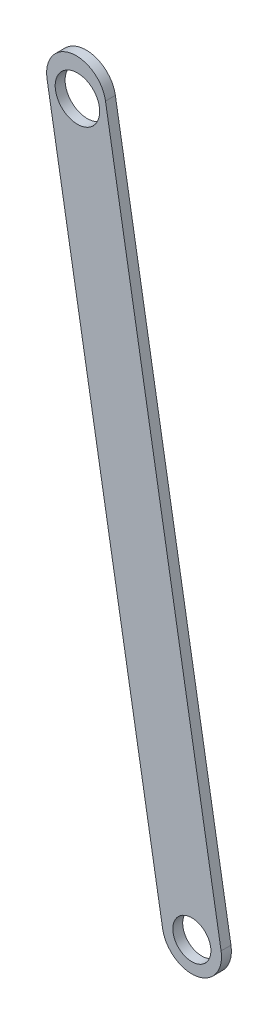
ISO-10303-21;
HEADER;
FILE_DESCRIPTION(('STEP AP214'),'2;1');
FILE_NAME('part.step','',(''),(''),'','','');
FILE_SCHEMA(('AUTOMOTIVE_DESIGN { 1 0 10303 214 1 1 1 1 }'));
ENDSEC;
DATA;
#1=APPLICATION_CONTEXT('core data for automotive mechanical design processes');
#2=APPLICATION_PROTOCOL_DEFINITION('international standard','automotive_design',2000,#1);
#3=PRODUCT_CONTEXT('',#1,'mechanical');
#4=PRODUCT('Part','Part','',(#3));
#5=PRODUCT_RELATED_PRODUCT_CATEGORY('part','',(#4));
#6=PRODUCT_DEFINITION_FORMATION('','',#4);
#7=PRODUCT_DEFINITION_CONTEXT('part definition',#1,'design');
#8=PRODUCT_DEFINITION('design','',#6,#7);
#9=PRODUCT_DEFINITION_SHAPE('','',#8);
#10=(LENGTH_UNIT() NAMED_UNIT(*) SI_UNIT(.MILLI.,.METRE.));
#11=(NAMED_UNIT(*) PLANE_ANGLE_UNIT() SI_UNIT($,.RADIAN.));
#12=(NAMED_UNIT(*) SI_UNIT($,.STERADIAN.) SOLID_ANGLE_UNIT());
#13=UNCERTAINTY_MEASURE_WITH_UNIT(LENGTH_MEASURE(1.E-05),#10,'distance_accuracy_value','');
#14=(GEOMETRIC_REPRESENTATION_CONTEXT(3) GLOBAL_UNCERTAINTY_ASSIGNED_CONTEXT((#13)) GLOBAL_UNIT_ASSIGNED_CONTEXT((#10,
#11,#12)) REPRESENTATION_CONTEXT('',''));
#15=CARTESIAN_POINT('',(0.,0.,0.));
#16=DIRECTION('',(0.,0.,1.));
#17=DIRECTION('',(1.,0.,0.));
#18=AXIS2_PLACEMENT_3D('',#15,#16,#17);
#19=CARTESIAN_POINT('',(-64.4585478566793,-10.9864582362244,6.35));
#20=DIRECTION('',(-0.985783727938957,-0.168019170723975,0.));
#21=DIRECTION('',(0.168019170723975,-0.985783727938957,0.));
#22=AXIS2_PLACEMENT_3D('',#19,#20,#21);
#23=PLANE('',#22);
#24=DIRECTION('',(-0.168019170723975,0.985783727938957,0.));
#25=VECTOR('',#24,1.);
#26=CARTESIAN_POINT('',(-64.4585478566793,-10.9864582362244,0.));
#27=LINE('',#26,#25);
#28=CARTESIAN_POINT('',(-108.220819982763,245.770765202292,0.));
#29=VERTEX_POINT('',#28);
#30=CARTESIAN_POINT('',(-182.478572675931,681.447741602193,0.));
#31=VERTEX_POINT('',#30);
#32=EDGE_CURVE('E119',#29,#31,#27,.T.);
#33=ORIENTED_EDGE('',*,*,#32,.T.);
#34=DIRECTION('',(0.,0.,-1.));
#35=VECTOR('',#34,1.);
#36=CARTESIAN_POINT('',(-182.478572675931,681.447741602193,6.35));
#37=LINE('',#36,#35);
#38=CARTESIAN_POINT('',(-182.478572675931,681.447741602193,6.35));
#39=VERTEX_POINT('',#38);
#40=EDGE_CURVE('E11',#39,#31,#37,.T.);
#41=ORIENTED_EDGE('',*,*,#40,.F.);
#42=DIRECTION('',(-0.168019170723975,0.985783727938957,0.));
#43=VECTOR('',#42,1.);
#44=CARTESIAN_POINT('',(-64.4585478566793,-10.9864582362244,6.35));
#45=LINE('',#44,#43);
#46=CARTESIAN_POINT('',(-108.220819982763,245.770765202292,6.35));
#47=VERTEX_POINT('',#46);
#48=EDGE_CURVE('E96',#47,#39,#45,.T.);
#49=ORIENTED_EDGE('',*,*,#48,.F.);
#50=DIRECTION('',(0.,0.,-1.));
#51=VECTOR('',#50,1.);
#52=CARTESIAN_POINT('',(-108.220819982763,245.770765202292,6.35));
#53=LINE('',#52,#51);
#54=EDGE_CURVE('E118',#47,#29,#53,.T.);
#55=ORIENTED_EDGE('',*,*,#54,.T.);
#56=EDGE_LOOP('',(#33,#41,#49,#55));
#57=FACE_BOUND('',#56,.T.);
#58=ADVANCED_FACE('F47',(#57),#23,.F.);
#59=CARTESIAN_POINT('',(-201.257752693168,678.246976399902,6.35));
#60=DIRECTION('',(0.,0.,-1.));
#61=DIRECTION('',(-1.,0.,0.));
#62=AXIS2_PLACEMENT_3D('',#59,#60,#61);
#63=CYLINDRICAL_SURFACE('',#62,19.0499999999999);
#64=CARTESIAN_POINT('',(-201.257752693168,678.246976399902,0.));
#65=DIRECTION('',(0.,0.,1.));
#66=DIRECTION('',(1.,0.,0.));
#67=AXIS2_PLACEMENT_3D('',#64,#65,#66);
#68=CIRCLE('',#67,19.0499999999999);
#69=CARTESIAN_POINT('',(-220.036932710405,675.04621119761,0.));
#70=VERTEX_POINT('',#69);
#71=EDGE_CURVE('E102',#31,#70,#68,.T.);
#72=ORIENTED_EDGE('',*,*,#71,.T.);
#73=DIRECTION('',(0.,0.,-1.));
#74=VECTOR('',#73,1.);
#75=CARTESIAN_POINT('',(-220.036932710405,675.04621119761,6.35));
#76=LINE('',#75,#74);
#77=CARTESIAN_POINT('',(-220.036932710405,675.04621119761,6.35));
#78=VERTEX_POINT('',#77);
#79=EDGE_CURVE('E56',#78,#70,#76,.T.);
#80=ORIENTED_EDGE('',*,*,#79,.F.);
#81=CARTESIAN_POINT('',(-201.257752693168,678.246976399902,6.35));
#82=DIRECTION('',(0.,0.,1.));
#83=DIRECTION('',(1.,0.,0.));
#84=AXIS2_PLACEMENT_3D('',#81,#82,#83);
#85=CIRCLE('',#84,19.0499999999999);
#86=EDGE_CURVE('E90',#39,#78,#85,.T.);
#87=ORIENTED_EDGE('',*,*,#86,.F.);
#88=ORIENTED_EDGE('',*,*,#40,.T.);
#89=EDGE_LOOP('',(#72,#80,#87,#88));
#90=FACE_BOUND('',#89,.T.);
#91=ADVANCED_FACE('F101',(#90),#63,.T.);
#92=CARTESIAN_POINT('',(-102.016907891154,-17.3879886408078,6.35));
#93=DIRECTION('',(-0.985783727938957,-0.168019170723974,0.));
#94=DIRECTION('',(0.168019170723974,-0.985783727938957,0.));
#95=AXIS2_PLACEMENT_3D('',#92,#93,#94);
#96=PLANE('',#95);
#97=DIRECTION('',(-0.168019170723974,0.985783727938957,0.));
#98=VECTOR('',#97,1.);
#99=CARTESIAN_POINT('',(-102.016907891154,-17.3879886408078,0.));
#100=LINE('',#99,#98);
#101=CARTESIAN_POINT('',(-145.779180017237,239.369234797708,0.));
#102=VERTEX_POINT('',#101);
#103=EDGE_CURVE('E126',#102,#70,#100,.T.);
#104=ORIENTED_EDGE('',*,*,#103,.F.);
#105=DIRECTION('',(0.,0.,-1.));
#106=VECTOR('',#105,1.);
#107=CARTESIAN_POINT('',(-145.779180017237,239.369234797708,6.35));
#108=LINE('',#107,#106);
#109=CARTESIAN_POINT('',(-145.779180017237,239.369234797708,6.35));
#110=VERTEX_POINT('',#109);
#111=EDGE_CURVE('E80',#110,#102,#108,.T.);
#112=ORIENTED_EDGE('',*,*,#111,.F.);
#113=DIRECTION('',(-0.168019170723974,0.985783727938957,0.));
#114=VECTOR('',#113,1.);
#115=CARTESIAN_POINT('',(-102.016907891154,-17.3879886408078,6.35));
#116=LINE('',#115,#114);
#117=EDGE_CURVE('E94',#110,#78,#116,.T.);
#118=ORIENTED_EDGE('',*,*,#117,.T.);
#119=ORIENTED_EDGE('',*,*,#79,.T.);
#120=EDGE_LOOP('',(#104,#112,#118,#119));
#121=FACE_BOUND('',#120,.T.);
#122=ADVANCED_FACE('F107',(#121),#96,.T.);
#123=CARTESIAN_POINT('',(-127.,242.57,6.35));
#124=DIRECTION('',(0.,0.,-1.));
#125=DIRECTION('',(-1.,0.,0.));
#126=AXIS2_PLACEMENT_3D('',#123,#124,#125);
#127=CYLINDRICAL_SURFACE('',#126,19.05);
#128=CARTESIAN_POINT('',(-127.,242.57,0.));
#129=DIRECTION('',(0.,0.,1.));
#130=DIRECTION('',(1.,0.,0.));
#131=AXIS2_PLACEMENT_3D('',#128,#129,#130);
#132=CIRCLE('',#131,19.05);
#133=EDGE_CURVE('E83',#102,#29,#132,.T.);
#134=ORIENTED_EDGE('',*,*,#133,.T.);
#135=ORIENTED_EDGE('',*,*,#54,.F.);
#136=CARTESIAN_POINT('',(-127.,242.57,6.35));
#137=DIRECTION('',(0.,0.,1.));
#138=DIRECTION('',(1.,0.,0.));
#139=AXIS2_PLACEMENT_3D('',#136,#137,#138);
#140=CIRCLE('',#139,19.05);
#141=EDGE_CURVE('E64',#110,#47,#140,.T.);
#142=ORIENTED_EDGE('',*,*,#141,.F.);
#143=ORIENTED_EDGE('',*,*,#111,.T.);
#144=EDGE_LOOP('',(#134,#135,#142,#143));
#145=FACE_BOUND('',#144,.T.);
#146=ADVANCED_FACE('F151',(#145),#127,.T.);
#147=CARTESIAN_POINT('',(-127.,242.57,6.35));
#148=DIRECTION('',(0.,0.,-1.));
#149=DIRECTION('',(-1.,0.,0.));
#150=AXIS2_PLACEMENT_3D('',#147,#148,#149);
#151=CYLINDRICAL_SURFACE('',#150,12.2250669185564);
#152=CARTESIAN_POINT('',(-127.,242.57,6.35));
#153=DIRECTION('',(0.,0.,1.));
#154=DIRECTION('',(1.,0.,0.));
#155=AXIS2_PLACEMENT_3D('',#152,#153,#154);
#156=CIRCLE('',#155,12.2250669185564);
#157=CARTESIAN_POINT('',(-114.774933081444,242.57,6.35));
#158=VERTEX_POINT('',#157);
#159=EDGE_CURVE('E111',#158,#158,#156,.T.);
#160=ORIENTED_EDGE('',*,*,#159,.T.);
#161=EDGE_LOOP('',(#160));
#162=FACE_BOUND('',#161,.T.);
#163=CARTESIAN_POINT('',(-127.,242.57,0.));
#164=DIRECTION('',(0.,0.,1.));
#165=DIRECTION('',(1.,0.,0.));
#166=AXIS2_PLACEMENT_3D('',#163,#164,#165);
#167=CIRCLE('',#166,12.2250669185564);
#168=CARTESIAN_POINT('',(-114.774933081444,242.57,0.));
#169=VERTEX_POINT('',#168);
#170=EDGE_CURVE('E131',#169,#169,#167,.T.);
#171=ORIENTED_EDGE('',*,*,#170,.F.);
#172=EDGE_LOOP('',(#171));
#173=FACE_BOUND('',#172,.T.);
#174=ADVANCED_FACE('F149',(#162,#173),#151,.F.);
#175=CARTESIAN_POINT('',(0.,0.,6.35));
#176=DIRECTION('',(0.,0.,1.));
#177=DIRECTION('',(1.,0.,0.));
#178=AXIS2_PLACEMENT_3D('',#175,#176,#177);
#179=PLANE('',#178);
#180=CARTESIAN_POINT('',(-200.49771659244,673.787775598498,6.35));
#181=DIRECTION('',(0.,0.,1.));
#182=DIRECTION('',(1.,0.,0.));
#183=AXIS2_PLACEMENT_3D('',#180,#181,#182);
#184=CIRCLE('',#183,14.2875000000016);
#185=CARTESIAN_POINT('',(-186.210216592439,673.787775598498,6.35));
#186=VERTEX_POINT('',#185);
#187=EDGE_CURVE('E123',#186,#186,#184,.T.);
#188=ORIENTED_EDGE('',*,*,#187,.F.);
#189=EDGE_LOOP('',(#188));
#190=FACE_BOUND('',#189,.T.);
#191=ORIENTED_EDGE('',*,*,#48,.T.);
#192=ORIENTED_EDGE('',*,*,#86,.T.);
#193=ORIENTED_EDGE('',*,*,#117,.F.);
#194=ORIENTED_EDGE('',*,*,#141,.T.);
#195=EDGE_LOOP('',(#191,#192,#193,#194));
#196=FACE_BOUND('',#195,.T.);
#197=ORIENTED_EDGE('',*,*,#159,.F.);
#198=EDGE_LOOP('',(#197));
#199=FACE_BOUND('',#198,.T.);
#200=ADVANCED_FACE('F91',(#190,#196,#199),#179,.T.);
#201=CARTESIAN_POINT('',(0.,0.,0.));
#202=DIRECTION('',(0.,0.,1.));
#203=DIRECTION('',(1.,0.,0.));
#204=AXIS2_PLACEMENT_3D('',#201,#202,#203);
#205=PLANE('',#204);
#206=CARTESIAN_POINT('',(-200.49771659244,673.787775598498,0.));
#207=DIRECTION('',(0.,0.,1.));
#208=DIRECTION('',(1.,0.,0.));
#209=AXIS2_PLACEMENT_3D('',#206,#207,#208);
#210=CIRCLE('',#209,14.2875000000016);
#211=CARTESIAN_POINT('',(-186.210216592439,673.787775598498,0.));
#212=VERTEX_POINT('',#211);
#213=EDGE_CURVE('E228',#212,#212,#210,.T.);
#214=ORIENTED_EDGE('',*,*,#213,.T.);
#215=EDGE_LOOP('',(#214));
#216=FACE_BOUND('',#215,.T.);
#217=ORIENTED_EDGE('',*,*,#32,.F.);
#218=ORIENTED_EDGE('',*,*,#133,.F.);
#219=ORIENTED_EDGE('',*,*,#103,.T.);
#220=ORIENTED_EDGE('',*,*,#71,.F.);
#221=EDGE_LOOP('',(#217,#218,#219,#220));
#222=FACE_BOUND('',#221,.T.);
#223=ORIENTED_EDGE('',*,*,#170,.T.);
#224=EDGE_LOOP('',(#223));
#225=FACE_BOUND('',#224,.T.);
#226=ADVANCED_FACE('F141',(#216,#222,#225),#205,.F.);
#227=CARTESIAN_POINT('',(-200.49771659244,673.787775598498,6.35));
#228=DIRECTION('',(0.,0.,-1.));
#229=DIRECTION('',(-1.,0.,0.));
#230=AXIS2_PLACEMENT_3D('',#227,#228,#229);
#231=CYLINDRICAL_SURFACE('',#230,14.2875000000016);
#232=ORIENTED_EDGE('',*,*,#187,.T.);
#233=EDGE_LOOP('',(#232));
#234=FACE_BOUND('',#233,.T.);
#235=ORIENTED_EDGE('',*,*,#213,.F.);
#236=EDGE_LOOP('',(#235));
#237=FACE_BOUND('',#236,.T.);
#238=ADVANCED_FACE('F144',(#234,#237),#231,.F.);
#239=CLOSED_SHELL('',(#58,#91,#122,#146,#174,#200,#226,#238));
#240=MANIFOLD_SOLID_BREP('B2',#239);
#241=ADVANCED_BREP_SHAPE_REPRESENTATION('',(#18,#240),#14);
#242=SHAPE_DEFINITION_REPRESENTATION(#9,#241);
ENDSEC;
END-ISO-10303-21;
